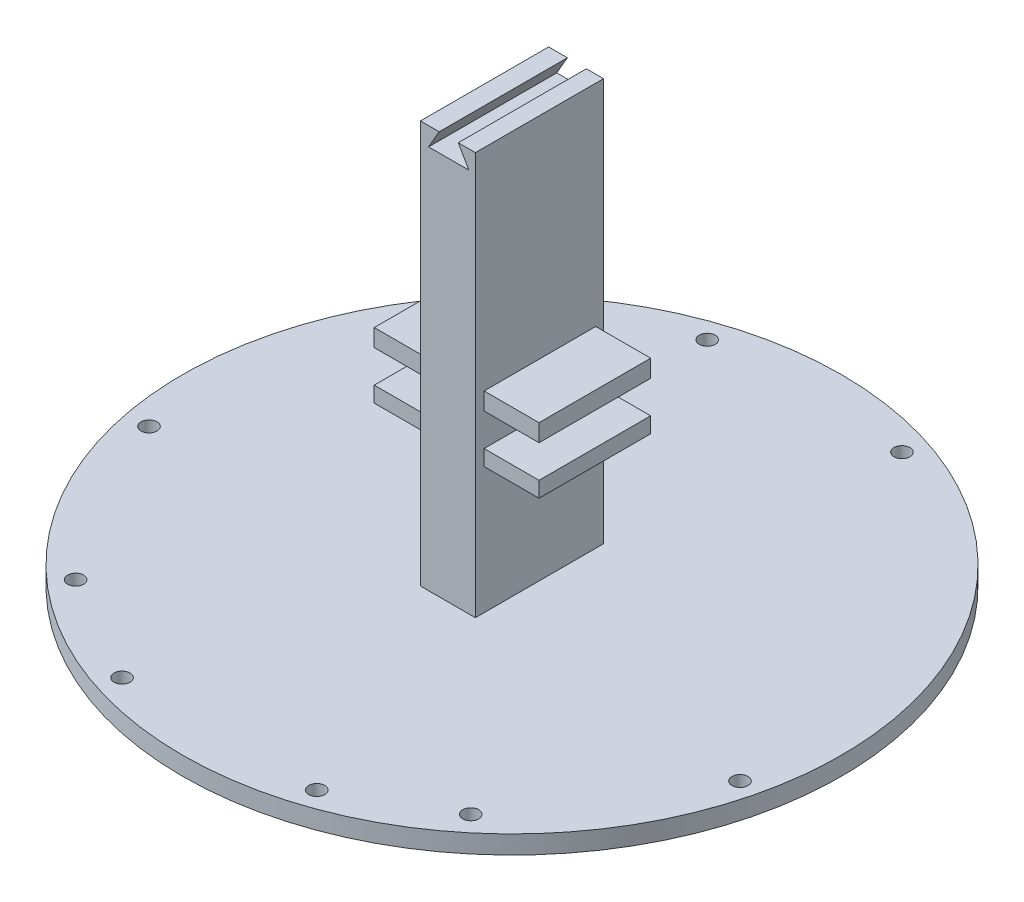
ISO-10303-21;
HEADER;
FILE_DESCRIPTION(('STEP AP214'),'2;1');
FILE_NAME('part.step','',(''),(''),'','','');
FILE_SCHEMA(('AUTOMOTIVE_DESIGN { 1 0 10303 214 1 1 1 1 }'));
ENDSEC;
DATA;
#1=APPLICATION_CONTEXT('core data for automotive mechanical design processes');
#2=APPLICATION_PROTOCOL_DEFINITION('international standard','automotive_design',2000,#1);
#3=PRODUCT_CONTEXT('',#1,'mechanical');
#4=PRODUCT('Part','Part','',(#3));
#5=PRODUCT_RELATED_PRODUCT_CATEGORY('part','',(#4));
#6=PRODUCT_DEFINITION_FORMATION('','',#4);
#7=PRODUCT_DEFINITION_CONTEXT('part definition',#1,'design');
#8=PRODUCT_DEFINITION('design','',#6,#7);
#9=PRODUCT_DEFINITION_SHAPE('','',#8);
#10=(LENGTH_UNIT() NAMED_UNIT(*) SI_UNIT(.MILLI.,.METRE.));
#11=(NAMED_UNIT(*) PLANE_ANGLE_UNIT() SI_UNIT($,.RADIAN.));
#12=(NAMED_UNIT(*) SI_UNIT($,.STERADIAN.) SOLID_ANGLE_UNIT());
#13=UNCERTAINTY_MEASURE_WITH_UNIT(LENGTH_MEASURE(1.E-05),#10,'distance_accuracy_value','');
#14=(GEOMETRIC_REPRESENTATION_CONTEXT(3) GLOBAL_UNCERTAINTY_ASSIGNED_CONTEXT((#13)) GLOBAL_UNIT_ASSIGNED_CONTEXT((#10,
#11,#12)) REPRESENTATION_CONTEXT('',''));
#15=CARTESIAN_POINT('',(0.,0.,0.));
#16=DIRECTION('',(0.,0.,1.));
#17=DIRECTION('',(1.,0.,0.));
#18=AXIS2_PLACEMENT_3D('',#15,#16,#17);
#19=CARTESIAN_POINT('',(-7.5,115.,17.5));
#20=DIRECTION('',(1.,0.,0.));
#21=DIRECTION('',(0.,0.,-1.));
#22=AXIS2_PLACEMENT_3D('',#19,#20,#21);
#23=PLANE('',#22);
#24=DIRECTION('',(0.,1.,0.));
#25=VECTOR('',#24,1.);
#26=CARTESIAN_POINT('',(-7.5,115.,-15.3709250448597));
#27=LINE('',#26,#25);
#28=CARTESIAN_POINT('',(-7.5,39.5746894468038,-15.3709250448597));
#29=VERTEX_POINT('',#28);
#30=CARTESIAN_POINT('',(-7.5,43.8235630364399,-15.3709250448597));
#31=VERTEX_POINT('',#30);
#32=EDGE_CURVE('E265',#29,#31,#27,.T.);
#33=ORIENTED_EDGE('',*,*,#32,.T.);
#34=DIRECTION('',(0.,0.,1.));
#35=VECTOR('',#34,1.);
#36=CARTESIAN_POINT('',(-7.5,43.8235630364399,17.5));
#37=LINE('',#36,#35);
#38=CARTESIAN_POINT('',(-7.5,43.8235630364399,15.1209913042929));
#39=VERTEX_POINT('',#38);
#40=EDGE_CURVE('E272',#31,#39,#37,.T.);
#41=ORIENTED_EDGE('',*,*,#40,.T.);
#42=DIRECTION('',(0.,-1.,0.));
#43=VECTOR('',#42,1.);
#44=CARTESIAN_POINT('',(-7.5,115.,15.1209913042929));
#45=LINE('',#44,#43);
#46=CARTESIAN_POINT('',(-7.5,39.5746894468038,15.1209913042929));
#47=VERTEX_POINT('',#46);
#48=EDGE_CURVE('E223',#39,#47,#45,.T.);
#49=ORIENTED_EDGE('',*,*,#48,.T.);
#50=DIRECTION('',(0.,0.,-1.));
#51=VECTOR('',#50,1.);
#52=CARTESIAN_POINT('',(-7.5,39.5746894468038,17.5));
#53=LINE('',#52,#51);
#54=EDGE_CURVE('E268',#47,#29,#53,.T.);
#55=ORIENTED_EDGE('',*,*,#54,.T.);
#56=EDGE_LOOP('',(#33,#41,#49,#55));
#57=FACE_BOUND('',#56,.T.);
#58=DIRECTION('',(0.,0.,1.));
#59=VECTOR('',#58,1.);
#60=CARTESIAN_POINT('',(-7.5,5.,17.5));
#61=LINE('',#60,#59);
#62=CARTESIAN_POINT('',(-7.5,5.,-17.5));
#63=VERTEX_POINT('',#62);
#64=CARTESIAN_POINT('',(-7.5,5.,17.5));
#65=VERTEX_POINT('',#64);
#66=EDGE_CURVE('E389',#63,#65,#61,.T.);
#67=ORIENTED_EDGE('',*,*,#66,.T.);
#68=DIRECTION('',(0.,-1.,0.));
#69=VECTOR('',#68,1.);
#70=CARTESIAN_POINT('',(-7.5,115.,17.5));
#71=LINE('',#70,#69);
#72=CARTESIAN_POINT('',(-7.5,115.,17.5));
#73=VERTEX_POINT('',#72);
#74=EDGE_CURVE('E423',#73,#65,#71,.T.);
#75=ORIENTED_EDGE('',*,*,#74,.F.);
#76=DIRECTION('',(0.,0.,1.));
#77=VECTOR('',#76,1.);
#78=CARTESIAN_POINT('',(-7.5,115.,17.5));
#79=LINE('',#78,#77);
#80=CARTESIAN_POINT('',(-7.5,115.,-17.5));
#81=VERTEX_POINT('',#80);
#82=EDGE_CURVE('E390',#81,#73,#79,.T.);
#83=ORIENTED_EDGE('',*,*,#82,.F.);
#84=DIRECTION('',(0.,-1.,0.));
#85=VECTOR('',#84,1.);
#86=CARTESIAN_POINT('',(-7.5,115.,-17.5));
#87=LINE('',#86,#85);
#88=EDGE_CURVE('E404',#81,#63,#87,.T.);
#89=ORIENTED_EDGE('',*,*,#88,.T.);
#90=EDGE_LOOP('',(#67,#75,#83,#89));
#91=FACE_BOUND('',#90,.T.);
#92=DIRECTION('',(0.,0.,1.));
#93=VECTOR('',#92,1.);
#94=CARTESIAN_POINT('',(-7.5,52.6962108265621,17.5));
#95=LINE('',#94,#93);
#96=CARTESIAN_POINT('',(-7.5,52.6962108265621,-15.3709250448597));
#97=VERTEX_POINT('',#96);
#98=CARTESIAN_POINT('',(-7.5,52.6962108265621,15.1209913042929));
#99=VERTEX_POINT('',#98);
#100=EDGE_CURVE('E320',#97,#99,#95,.T.);
#101=ORIENTED_EDGE('',*,*,#100,.F.);
#102=DIRECTION('',(0.,-1.,0.));
#103=VECTOR('',#102,1.);
#104=CARTESIAN_POINT('',(-7.5,115.,-15.3709250448597));
#105=LINE('',#104,#103);
#106=CARTESIAN_POINT('',(-7.5,57.4449518973318,-15.3709250448597));
#107=VERTEX_POINT('',#106);
#108=EDGE_CURVE('E299',#107,#97,#105,.T.);
#109=ORIENTED_EDGE('',*,*,#108,.F.);
#110=DIRECTION('',(0.,0.,-1.));
#111=VECTOR('',#110,1.);
#112=CARTESIAN_POINT('',(-7.5,57.4449518973318,17.5));
#113=LINE('',#112,#111);
#114=CARTESIAN_POINT('',(-7.5,57.4449518973318,15.1209913042929));
#115=VERTEX_POINT('',#114);
#116=EDGE_CURVE('E314',#115,#107,#113,.T.);
#117=ORIENTED_EDGE('',*,*,#116,.F.);
#118=DIRECTION('',(0.,1.,0.));
#119=VECTOR('',#118,1.);
#120=CARTESIAN_POINT('',(-7.5,115.,15.1209913042929));
#121=LINE('',#120,#119);
#122=EDGE_CURVE('E317',#99,#115,#121,.T.);
#123=ORIENTED_EDGE('',*,*,#122,.F.);
#124=EDGE_LOOP('',(#101,#109,#117,#123));
#125=FACE_BOUND('',#124,.T.);
#126=ADVANCED_FACE('F56',(#57,#91,#125),#23,.F.);
#127=CARTESIAN_POINT('',(7.5,115.,17.5));
#128=DIRECTION('',(-1.,0.,0.));
#129=DIRECTION('',(0.,0.,1.));
#130=AXIS2_PLACEMENT_3D('',#127,#128,#129);
#131=PLANE('',#130);
#132=DIRECTION('',(0.,1.,0.));
#133=VECTOR('',#132,1.);
#134=CARTESIAN_POINT('',(7.5,115.,15.1209913042929));
#135=LINE('',#134,#133);
#136=CARTESIAN_POINT('',(7.5,39.5746894468038,15.1209913042929));
#137=VERTEX_POINT('',#136);
#138=CARTESIAN_POINT('',(7.5,43.8235630364399,15.1209913042929));
#139=VERTEX_POINT('',#138);
#140=EDGE_CURVE('E64',#137,#139,#135,.T.);
#141=ORIENTED_EDGE('',*,*,#140,.T.);
#142=DIRECTION('',(0.,0.,-1.));
#143=VECTOR('',#142,1.);
#144=CARTESIAN_POINT('',(7.5,43.8235630364399,17.5));
#145=LINE('',#144,#143);
#146=CARTESIAN_POINT('',(7.5,43.8235630364399,-15.3709250448597));
#147=VERTEX_POINT('',#146);
#148=EDGE_CURVE('E14',#139,#147,#145,.T.);
#149=ORIENTED_EDGE('',*,*,#148,.T.);
#150=DIRECTION('',(0.,-1.,0.));
#151=VECTOR('',#150,1.);
#152=CARTESIAN_POINT('',(7.5,115.,-15.3709250448597));
#153=LINE('',#152,#151);
#154=CARTESIAN_POINT('',(7.5,39.5746894468038,-15.3709250448597));
#155=VERTEX_POINT('',#154);
#156=EDGE_CURVE('E451',#147,#155,#153,.T.);
#157=ORIENTED_EDGE('',*,*,#156,.T.);
#158=DIRECTION('',(0.,0.,1.));
#159=VECTOR('',#158,1.);
#160=CARTESIAN_POINT('',(7.5,39.5746894468038,17.5));
#161=LINE('',#160,#159);
#162=EDGE_CURVE('E454',#155,#137,#161,.T.);
#163=ORIENTED_EDGE('',*,*,#162,.T.);
#164=EDGE_LOOP('',(#141,#149,#157,#163));
#165=FACE_BOUND('',#164,.T.);
#166=DIRECTION('',(0.,0.,-1.));
#167=VECTOR('',#166,1.);
#168=CARTESIAN_POINT('',(7.5,5.,17.5));
#169=LINE('',#168,#167);
#170=CARTESIAN_POINT('',(7.5,5.,17.5));
#171=VERTEX_POINT('',#170);
#172=CARTESIAN_POINT('',(7.5,5.,-17.5));
#173=VERTEX_POINT('',#172);
#174=EDGE_CURVE('E410',#171,#173,#169,.T.);
#175=ORIENTED_EDGE('',*,*,#174,.T.);
#176=DIRECTION('',(0.,-1.,0.));
#177=VECTOR('',#176,1.);
#178=CARTESIAN_POINT('',(7.5,115.,-17.5));
#179=LINE('',#178,#177);
#180=CARTESIAN_POINT('',(7.5,115.,-17.5));
#181=VERTEX_POINT('',#180);
#182=EDGE_CURVE('E417',#181,#173,#179,.T.);
#183=ORIENTED_EDGE('',*,*,#182,.F.);
#184=DIRECTION('',(0.,0.,-1.));
#185=VECTOR('',#184,1.);
#186=CARTESIAN_POINT('',(7.5,115.,17.5));
#187=LINE('',#186,#185);
#188=CARTESIAN_POINT('',(7.5,115.,17.5));
#189=VERTEX_POINT('',#188);
#190=EDGE_CURVE('E398',#189,#181,#187,.T.);
#191=ORIENTED_EDGE('',*,*,#190,.F.);
#192=DIRECTION('',(0.,-1.,0.));
#193=VECTOR('',#192,1.);
#194=CARTESIAN_POINT('',(7.5,115.,17.5));
#195=LINE('',#194,#193);
#196=EDGE_CURVE('E420',#189,#171,#195,.T.);
#197=ORIENTED_EDGE('',*,*,#196,.T.);
#198=EDGE_LOOP('',(#175,#183,#191,#197));
#199=FACE_BOUND('',#198,.T.);
#200=DIRECTION('',(0.,0.,-1.));
#201=VECTOR('',#200,1.);
#202=CARTESIAN_POINT('',(7.5,52.6962108265621,17.5));
#203=LINE('',#202,#201);
#204=CARTESIAN_POINT('',(7.5,52.6962108265621,15.1209913042929));
#205=VERTEX_POINT('',#204);
#206=CARTESIAN_POINT('',(7.5,52.6962108265621,-15.3709250448597));
#207=VERTEX_POINT('',#206);
#208=EDGE_CURVE('E448',#205,#207,#203,.T.);
#209=ORIENTED_EDGE('',*,*,#208,.F.);
#210=DIRECTION('',(0.,-1.,0.));
#211=VECTOR('',#210,1.);
#212=CARTESIAN_POINT('',(7.5,115.,15.1209913042929));
#213=LINE('',#212,#211);
#214=CARTESIAN_POINT('',(7.5,57.4449518973318,15.1209913042929));
#215=VERTEX_POINT('',#214);
#216=EDGE_CURVE('E445',#215,#205,#213,.T.);
#217=ORIENTED_EDGE('',*,*,#216,.F.);
#218=DIRECTION('',(0.,0.,1.));
#219=VECTOR('',#218,1.);
#220=CARTESIAN_POINT('',(7.5,57.4449518973318,17.5));
#221=LINE('',#220,#219);
#222=CARTESIAN_POINT('',(7.5,57.4449518973318,-15.3709250448597));
#223=VERTEX_POINT('',#222);
#224=EDGE_CURVE('E442',#223,#215,#221,.T.);
#225=ORIENTED_EDGE('',*,*,#224,.F.);
#226=DIRECTION('',(0.,1.,0.));
#227=VECTOR('',#226,1.);
#228=CARTESIAN_POINT('',(7.5,115.,-15.3709250448597));
#229=LINE('',#228,#227);
#230=EDGE_CURVE('E439',#207,#223,#229,.T.);
#231=ORIENTED_EDGE('',*,*,#230,.F.);
#232=EDGE_LOOP('',(#209,#217,#225,#231));
#233=FACE_BOUND('',#232,.T.);
#234=ADVANCED_FACE('F458',(#165,#199,#233),#131,.F.);
#235=CARTESIAN_POINT('',(0.,115.,0.));
#236=DIRECTION('',(0.,1.,0.));
#237=DIRECTION('',(0.,0.,1.));
#238=AXIS2_PLACEMENT_3D('',#235,#236,#237);
#239=PLANE('',#238);
#240=DIRECTION('',(0.,0.,-1.));
#241=VECTOR('',#240,1.);
#242=CARTESIAN_POINT('',(2.82644831534013,115.,0.));
#243=LINE('',#242,#241);
#244=CARTESIAN_POINT('',(2.82644831534013,115.,17.5));
#245=VERTEX_POINT('',#244);
#246=CARTESIAN_POINT('',(2.82644831534013,115.,-17.5));
#247=VERTEX_POINT('',#246);
#248=EDGE_CURVE('E434',#245,#247,#243,.T.);
#249=ORIENTED_EDGE('',*,*,#248,.F.);
#250=DIRECTION('',(1.,0.,0.));
#251=VECTOR('',#250,1.);
#252=CARTESIAN_POINT('',(7.5,115.,17.5));
#253=LINE('',#252,#251);
#254=EDGE_CURVE('E393',#245,#189,#253,.T.);
#255=ORIENTED_EDGE('',*,*,#254,.T.);
#256=ORIENTED_EDGE('',*,*,#190,.T.);
#257=DIRECTION('',(-1.,0.,0.));
#258=VECTOR('',#257,1.);
#259=CARTESIAN_POINT('',(7.5,115.,-17.5));
#260=LINE('',#259,#258);
#261=EDGE_CURVE('E401',#181,#247,#260,.T.);
#262=ORIENTED_EDGE('',*,*,#261,.T.);
#263=EDGE_LOOP('',(#249,#255,#256,#262));
#264=FACE_BOUND('',#263,.T.);
#265=ADVANCED_FACE('F487',(#264),#239,.T.);
#266=CARTESIAN_POINT('',(0.,5.,0.));
#267=DIRECTION('',(0.,-1.,0.));
#268=DIRECTION('',(0.,0.,-1.));
#269=AXIS2_PLACEMENT_3D('',#266,#267,#268);
#270=CYLINDRICAL_SURFACE('',#269,90.);
#271=CARTESIAN_POINT('',(0.,5.,0.));
#272=DIRECTION('',(0.,1.,0.));
#273=DIRECTION('',(0.,0.,1.));
#274=AXIS2_PLACEMENT_3D('',#271,#272,#273);
#275=CIRCLE('',#274,90.);
#276=CARTESIAN_POINT('',(0.,5.,90.));
#277=VERTEX_POINT('',#276);
#278=EDGE_CURVE('E427',#277,#277,#275,.T.);
#279=ORIENTED_EDGE('',*,*,#278,.F.);
#280=EDGE_LOOP('',(#279));
#281=FACE_BOUND('',#280,.T.);
#282=CARTESIAN_POINT('',(0.,0.,0.));
#283=DIRECTION('',(0.,1.,0.));
#284=DIRECTION('',(0.,0.,1.));
#285=AXIS2_PLACEMENT_3D('',#282,#283,#284);
#286=CIRCLE('',#285,90.);
#287=CARTESIAN_POINT('',(0.,0.,90.));
#288=VERTEX_POINT('',#287);
#289=EDGE_CURVE('E426',#288,#288,#286,.T.);
#290=ORIENTED_EDGE('',*,*,#289,.T.);
#291=EDGE_LOOP('',(#290));
#292=FACE_BOUND('',#291,.T.);
#293=ADVANCED_FACE('F58',(#281,#292),#270,.T.);
#294=CARTESIAN_POINT('',(0.,5.,0.));
#295=DIRECTION('',(0.,1.,0.));
#296=DIRECTION('',(0.,0.,1.));
#297=AXIS2_PLACEMENT_3D('',#294,#295,#296);
#298=PLANE('',#297);
#299=CARTESIAN_POINT('',(-82.3103290653493,5.,16.825152102193));
#300=DIRECTION('',(0.,1.,0.));
#301=DIRECTION('',(0.,0.,1.));
#302=AXIS2_PLACEMENT_3D('',#299,#300,#301);
#303=CIRCLE('',#302,2.18255);
#304=CARTESIAN_POINT('',(-82.3103290653493,5.,19.007702102193));
#305=VERTEX_POINT('',#304);
#306=EDGE_CURVE('E368',#305,#305,#303,.T.);
#307=ORIENTED_EDGE('',*,*,#306,.F.);
#308=EDGE_LOOP('',(#307));
#309=FACE_BOUND('',#308,.T.);
#310=CARTESIAN_POINT('',(-56.093218167113,5.,63.0821731492684));
#311=DIRECTION('',(0.,1.,0.));
#312=DIRECTION('',(0.,0.,1.));
#313=AXIS2_PLACEMENT_3D('',#310,#311,#312);
#314=CIRCLE('',#313,2.18255);
#315=CARTESIAN_POINT('',(-56.093218167113,5.,65.2647231492684));
#316=VERTEX_POINT('',#315);
#317=EDGE_CURVE('E365',#316,#316,#314,.T.);
#318=ORIENTED_EDGE('',*,*,#317,.F.);
#319=EDGE_LOOP('',(#318));
#320=FACE_BOUND('',#319,.T.);
#321=CARTESIAN_POINT('',(-26.585,5.,79.9073252514612));
#322=DIRECTION('',(0.,1.,0.));
#323=DIRECTION('',(0.,0.,1.));
#324=AXIS2_PLACEMENT_3D('',#321,#322,#323);
#325=CIRCLE('',#324,2.18255);
#326=CARTESIAN_POINT('',(-26.585,5.,82.0898752514612));
#327=VERTEX_POINT('',#326);
#328=EDGE_CURVE('E362',#327,#327,#325,.T.);
#329=ORIENTED_EDGE('',*,*,#328,.F.);
#330=EDGE_LOOP('',(#329));
#331=FACE_BOUND('',#330,.T.);
#332=CARTESIAN_POINT('',(26.585,5.,79.9073252514612));
#333=DIRECTION('',(0.,1.,0.));
#334=DIRECTION('',(0.,0.,1.));
#335=AXIS2_PLACEMENT_3D('',#332,#333,#334);
#336=CIRCLE('',#335,2.18255);
#337=CARTESIAN_POINT('',(26.585,5.,82.0898752514612));
#338=VERTEX_POINT('',#337);
#339=EDGE_CURVE('E359',#338,#338,#336,.T.);
#340=ORIENTED_EDGE('',*,*,#339,.F.);
#341=EDGE_LOOP('',(#340));
#342=FACE_BOUND('',#341,.T.);
#343=CARTESIAN_POINT('',(82.2453022818043,5.,19.9780897386926));
#344=DIRECTION('',(0.,1.,0.));
#345=DIRECTION('',(0.,0.,1.));
#346=AXIS2_PLACEMENT_3D('',#343,#344,#345);
#347=CIRCLE('',#346,2.18255);
#348=CARTESIAN_POINT('',(82.2453022818043,5.,22.1606397386926));
#349=VERTEX_POINT('',#348);
#350=EDGE_CURVE('E356',#349,#349,#347,.T.);
#351=ORIENTED_EDGE('',*,*,#350,.F.);
#352=EDGE_LOOP('',(#351));
#353=FACE_BOUND('',#352,.T.);
#354=CARTESIAN_POINT('',(53.3465637883439,5.,64.6125029474108));
#355=DIRECTION('',(0.,1.,0.));
#356=DIRECTION('',(0.,0.,1.));
#357=AXIS2_PLACEMENT_3D('',#354,#355,#356);
#358=CIRCLE('',#357,2.18255);
#359=CARTESIAN_POINT('',(53.3465637883439,5.,66.7950529474108));
#360=VERTEX_POINT('',#359);
#361=EDGE_CURVE('E353',#360,#360,#358,.T.);
#362=ORIENTED_EDGE('',*,*,#361,.F.);
#363=EDGE_LOOP('',(#362));
#364=FACE_BOUND('',#363,.T.);
#365=CARTESIAN_POINT('',(26.5850000000001,5.,-79.9073252514612));
#366=DIRECTION('',(0.,1.,0.));
#367=DIRECTION('',(0.,0.,1.));
#368=AXIS2_PLACEMENT_3D('',#365,#366,#367);
#369=CIRCLE('',#368,2.18255);
#370=CARTESIAN_POINT('',(26.5850000000001,5.,-77.7247752514612));
#371=VERTEX_POINT('',#370);
#372=EDGE_CURVE('E350',#371,#371,#369,.T.);
#373=ORIENTED_EDGE('',*,*,#372,.F.);
#374=EDGE_LOOP('',(#373));
#375=FACE_BOUND('',#374,.T.);
#376=CARTESIAN_POINT('',(-26.585,5.,-79.9073252514612));
#377=DIRECTION('',(0.,1.,0.));
#378=DIRECTION('',(0.,0.,1.));
#379=AXIS2_PLACEMENT_3D('',#376,#377,#378);
#380=CIRCLE('',#379,2.18255);
#381=CARTESIAN_POINT('',(-26.585,5.,-77.7247752514612));
#382=VERTEX_POINT('',#381);
#383=EDGE_CURVE('E327',#382,#382,#380,.T.);
#384=ORIENTED_EDGE('',*,*,#383,.F.);
#385=EDGE_LOOP('',(#384));
#386=FACE_BOUND('',#385,.T.);
#387=ORIENTED_EDGE('',*,*,#66,.F.);
#388=DIRECTION('',(-1.,0.,0.));
#389=VECTOR('',#388,1.);
#390=CARTESIAN_POINT('',(7.5,5.,-17.5));
#391=LINE('',#390,#389);
#392=EDGE_CURVE('E394',#173,#63,#391,.T.);
#393=ORIENTED_EDGE('',*,*,#392,.F.);
#394=ORIENTED_EDGE('',*,*,#174,.F.);
#395=DIRECTION('',(1.,0.,0.));
#396=VECTOR('',#395,1.);
#397=CARTESIAN_POINT('',(7.5,5.,17.5));
#398=LINE('',#397,#396);
#399=EDGE_CURVE('E407',#65,#171,#398,.T.);
#400=ORIENTED_EDGE('',*,*,#399,.F.);
#401=EDGE_LOOP('',(#387,#393,#394,#400));
#402=FACE_BOUND('',#401,.T.);
#403=ORIENTED_EDGE('',*,*,#278,.T.);
#404=EDGE_LOOP('',(#403));
#405=FACE_BOUND('',#404,.T.);
#406=ADVANCED_FACE('F493',(#309,#320,#331,#342,#353,#364,#375,#386,#402,#405),#298,.T.);
#407=CARTESIAN_POINT('',(0.,0.,0.));
#408=DIRECTION('',(0.,1.,0.));
#409=DIRECTION('',(0.,0.,1.));
#410=AXIS2_PLACEMENT_3D('',#407,#408,#409);
#411=PLANE('',#410);
#412=CARTESIAN_POINT('',(-82.3103290653493,0.,16.825152102193));
#413=DIRECTION('',(0.,-1.,0.));
#414=DIRECTION('',(0.,0.,-1.));
#415=AXIS2_PLACEMENT_3D('',#412,#413,#414);
#416=CIRCLE('',#415,2.18255);
#417=CARTESIAN_POINT('',(-82.3103290653493,0.,14.642602102193));
#418=VERTEX_POINT('',#417);
#419=EDGE_CURVE('E324',#418,#418,#416,.T.);
#420=ORIENTED_EDGE('',*,*,#419,.F.);
#421=EDGE_LOOP('',(#420));
#422=FACE_BOUND('',#421,.T.);
#423=CARTESIAN_POINT('',(-56.093218167113,0.,63.0821731492684));
#424=DIRECTION('',(0.,-1.,0.));
#425=DIRECTION('',(0.,0.,-1.));
#426=AXIS2_PLACEMENT_3D('',#423,#424,#425);
#427=CIRCLE('',#426,2.18255);
#428=CARTESIAN_POINT('',(-56.093218167113,0.,60.8996231492684));
#429=VERTEX_POINT('',#428);
#430=EDGE_CURVE('E323',#429,#429,#427,.T.);
#431=ORIENTED_EDGE('',*,*,#430,.F.);
#432=EDGE_LOOP('',(#431));
#433=FACE_BOUND('',#432,.T.);
#434=CARTESIAN_POINT('',(-26.585,0.,79.9073252514612));
#435=DIRECTION('',(0.,-1.,0.));
#436=DIRECTION('',(0.,0.,-1.));
#437=AXIS2_PLACEMENT_3D('',#434,#435,#436);
#438=CIRCLE('',#437,2.18255);
#439=CARTESIAN_POINT('',(-26.585,0.,77.7247752514612));
#440=VERTEX_POINT('',#439);
#441=EDGE_CURVE('E333',#440,#440,#438,.T.);
#442=ORIENTED_EDGE('',*,*,#441,.F.);
#443=EDGE_LOOP('',(#442));
#444=FACE_BOUND('',#443,.T.);
#445=CARTESIAN_POINT('',(26.585,0.,79.9073252514612));
#446=DIRECTION('',(0.,-1.,0.));
#447=DIRECTION('',(0.,0.,-1.));
#448=AXIS2_PLACEMENT_3D('',#445,#446,#447);
#449=CIRCLE('',#448,2.18255);
#450=CARTESIAN_POINT('',(26.585,0.,77.7247752514612));
#451=VERTEX_POINT('',#450);
#452=EDGE_CURVE('E329',#451,#451,#449,.T.);
#453=ORIENTED_EDGE('',*,*,#452,.F.);
#454=EDGE_LOOP('',(#453));
#455=FACE_BOUND('',#454,.T.);
#456=CARTESIAN_POINT('',(82.2453022818043,0.,19.9780897386926));
#457=DIRECTION('',(0.,-1.,0.));
#458=DIRECTION('',(0.,0.,-1.));
#459=AXIS2_PLACEMENT_3D('',#456,#457,#458);
#460=CIRCLE('',#459,2.18255);
#461=CARTESIAN_POINT('',(82.2453022818043,0.,17.7955397386926));
#462=VERTEX_POINT('',#461);
#463=EDGE_CURVE('E332',#462,#462,#460,.T.);
#464=ORIENTED_EDGE('',*,*,#463,.F.);
#465=EDGE_LOOP('',(#464));
#466=FACE_BOUND('',#465,.T.);
#467=CARTESIAN_POINT('',(53.3465637883439,0.,64.6125029474108));
#468=DIRECTION('',(0.,-1.,0.));
#469=DIRECTION('',(0.,0.,-1.));
#470=AXIS2_PLACEMENT_3D('',#467,#468,#469);
#471=CIRCLE('',#470,2.18255);
#472=CARTESIAN_POINT('',(53.3465637883439,0.,62.4299529474108));
#473=VERTEX_POINT('',#472);
#474=EDGE_CURVE('E343',#473,#473,#471,.T.);
#475=ORIENTED_EDGE('',*,*,#474,.F.);
#476=EDGE_LOOP('',(#475));
#477=FACE_BOUND('',#476,.T.);
#478=CARTESIAN_POINT('',(26.5850000000001,0.,-79.9073252514612));
#479=DIRECTION('',(0.,-1.,0.));
#480=DIRECTION('',(0.,0.,-1.));
#481=AXIS2_PLACEMENT_3D('',#478,#479,#480);
#482=CIRCLE('',#481,2.18255);
#483=CARTESIAN_POINT('',(26.5850000000001,0.,-82.0898752514612));
#484=VERTEX_POINT('',#483);
#485=EDGE_CURVE('E340',#484,#484,#482,.T.);
#486=ORIENTED_EDGE('',*,*,#485,.F.);
#487=EDGE_LOOP('',(#486));
#488=FACE_BOUND('',#487,.T.);
#489=CARTESIAN_POINT('',(-26.585,0.,-79.9073252514612));
#490=DIRECTION('',(0.,-1.,0.));
#491=DIRECTION('',(0.,0.,-1.));
#492=AXIS2_PLACEMENT_3D('',#489,#490,#491);
#493=CIRCLE('',#492,2.18255);
#494=CARTESIAN_POINT('',(-26.585,0.,-82.0898752514612));
#495=VERTEX_POINT('',#494);
#496=EDGE_CURVE('E328',#495,#495,#493,.T.);
#497=ORIENTED_EDGE('',*,*,#496,.F.);
#498=EDGE_LOOP('',(#497));
#499=FACE_BOUND('',#498,.T.);
#500=ORIENTED_EDGE('',*,*,#289,.F.);
#501=EDGE_LOOP('',(#500));
#502=FACE_BOUND('',#501,.T.);
#503=ADVANCED_FACE('F495',(#422,#433,#444,#455,#466,#477,#488,#499,#502),#411,.F.);
#504=CARTESIAN_POINT('',(7.5,115.,17.5));
#505=DIRECTION('',(0.,0.,-1.));
#506=DIRECTION('',(-1.,0.,0.));
#507=AXIS2_PLACEMENT_3D('',#504,#505,#506);
#508=PLANE('',#507);
#509=ORIENTED_EDGE('',*,*,#254,.F.);
#510=DIRECTION('',(-0.499999999999996,0.866025403784441,0.));
#511=VECTOR('',#510,1.);
#512=CARTESIAN_POINT('',(2.82644831534013,115.,17.5));
#513=LINE('',#512,#511);
#514=CARTESIAN_POINT('',(5.7264483153401,109.97705265805,17.5));
#515=VERTEX_POINT('',#514);
#516=EDGE_CURVE('E371',#515,#245,#513,.T.);
#517=ORIENTED_EDGE('',*,*,#516,.F.);
#518=DIRECTION('',(1.,0.,0.));
#519=VECTOR('',#518,1.);
#520=CARTESIAN_POINT('',(5.7264483153401,109.97705265805,17.5));
#521=LINE('',#520,#519);
#522=CARTESIAN_POINT('',(-5.2735516846599,109.97705265805,17.5));
#523=VERTEX_POINT('',#522);
#524=EDGE_CURVE('E376',#523,#515,#521,.T.);
#525=ORIENTED_EDGE('',*,*,#524,.F.);
#526=DIRECTION('',(-0.500000000000006,-0.866025403784435,0.));
#527=VECTOR('',#526,1.);
#528=CARTESIAN_POINT('',(-5.2735516846599,109.97705265805,17.5));
#529=LINE('',#528,#527);
#530=CARTESIAN_POINT('',(-2.37355168465986,115.,17.5));
#531=VERTEX_POINT('',#530);
#532=EDGE_CURVE('E373',#531,#523,#529,.T.);
#533=ORIENTED_EDGE('',*,*,#532,.F.);
#534=EDGE_CURVE('E395',#73,#531,#253,.T.);
#535=ORIENTED_EDGE('',*,*,#534,.F.);
#536=ORIENTED_EDGE('',*,*,#74,.T.);
#537=ORIENTED_EDGE('',*,*,#399,.T.);
#538=ORIENTED_EDGE('',*,*,#196,.F.);
#539=EDGE_LOOP('',(#509,#517,#525,#533,#535,#536,#537,#538));
#540=FACE_BOUND('',#539,.T.);
#541=ADVANCED_FACE('F492',(#540),#508,.F.);
#542=CARTESIAN_POINT('',(7.5,115.,-17.5));
#543=DIRECTION('',(0.,0.,1.));
#544=DIRECTION('',(1.,0.,0.));
#545=AXIS2_PLACEMENT_3D('',#542,#543,#544);
#546=PLANE('',#545);
#547=DIRECTION('',(1.,0.,0.));
#548=VECTOR('',#547,1.);
#549=CARTESIAN_POINT('',(7.5,109.97705265805,-17.5));
#550=LINE('',#549,#548);
#551=CARTESIAN_POINT('',(-5.2735516846599,109.97705265805,-17.5));
#552=VERTEX_POINT('',#551);
#553=CARTESIAN_POINT('',(5.7264483153401,109.97705265805,-17.5));
#554=VERTEX_POINT('',#553);
#555=EDGE_CURVE('E436',#552,#554,#550,.T.);
#556=ORIENTED_EDGE('',*,*,#555,.T.);
#557=DIRECTION('',(-0.499999999999996,0.866025403784441,0.));
#558=VECTOR('',#557,1.);
#559=CARTESIAN_POINT('',(3.99483623650507,112.976292757593,-17.5));
#560=LINE('',#559,#558);
#561=EDGE_CURVE('E386',#554,#247,#560,.T.);
#562=ORIENTED_EDGE('',*,*,#561,.T.);
#563=ORIENTED_EDGE('',*,*,#261,.F.);
#564=ORIENTED_EDGE('',*,*,#182,.T.);
#565=ORIENTED_EDGE('',*,*,#392,.T.);
#566=ORIENTED_EDGE('',*,*,#88,.F.);
#567=CARTESIAN_POINT('',(-2.37355168465984,115.,-17.5));
#568=VERTEX_POINT('',#567);
#569=EDGE_CURVE('E400',#568,#81,#260,.T.);
#570=ORIENTED_EDGE('',*,*,#569,.F.);
#571=DIRECTION('',(-0.500000000000006,-0.866025403784435,0.));
#572=VECTOR('',#571,1.);
#573=CARTESIAN_POINT('',(0.0948362365051714,119.275373292247,-17.5));
#574=LINE('',#573,#572);
#575=EDGE_CURVE('E382',#568,#552,#574,.T.);
#576=ORIENTED_EDGE('',*,*,#575,.T.);
#577=EDGE_LOOP('',(#556,#562,#563,#564,#565,#566,#570,#576));
#578=FACE_BOUND('',#577,.T.);
#579=ADVANCED_FACE('F502',(#578),#546,.F.);
#580=DIRECTION('',(0.,0.,1.));
#581=VECTOR('',#580,1.);
#582=CARTESIAN_POINT('',(-2.37355168465984,115.,0.));
#583=LINE('',#582,#581);
#584=EDGE_CURVE('E430',#568,#531,#583,.T.);
#585=ORIENTED_EDGE('',*,*,#584,.F.);
#586=ORIENTED_EDGE('',*,*,#569,.T.);
#587=ORIENTED_EDGE('',*,*,#82,.T.);
#588=ORIENTED_EDGE('',*,*,#534,.T.);
#589=EDGE_LOOP('',(#585,#586,#587,#588));
#590=FACE_BOUND('',#589,.T.);
#591=ADVANCED_FACE('F529',(#590),#239,.T.);
#592=CARTESIAN_POINT('',(5.7264483153401,109.97705265805,-18.5));
#593=DIRECTION('',(0.,-1.,0.));
#594=DIRECTION('',(0.,0.,-1.));
#595=AXIS2_PLACEMENT_3D('',#592,#593,#594);
#596=PLANE('',#595);
#597=DIRECTION('',(0.,0.,1.));
#598=VECTOR('',#597,1.);
#599=CARTESIAN_POINT('',(-5.2735516846599,109.97705265805,-18.5));
#600=LINE('',#599,#598);
#601=EDGE_CURVE('E379',#552,#523,#600,.T.);
#602=ORIENTED_EDGE('',*,*,#601,.T.);
#603=ORIENTED_EDGE('',*,*,#524,.T.);
#604=DIRECTION('',(0.,0.,1.));
#605=VECTOR('',#604,1.);
#606=CARTESIAN_POINT('',(5.7264483153401,109.97705265805,-18.5));
#607=LINE('',#606,#605);
#608=EDGE_CURVE('E380',#554,#515,#607,.T.);
#609=ORIENTED_EDGE('',*,*,#608,.F.);
#610=ORIENTED_EDGE('',*,*,#555,.F.);
#611=EDGE_LOOP('',(#602,#603,#609,#610));
#612=FACE_BOUND('',#611,.T.);
#613=ADVANCED_FACE('F538',(#612),#596,.F.);
#614=CARTESIAN_POINT('',(2.82644831534013,115.,-18.5));
#615=DIRECTION('',(0.866025403784441,0.499999999999996,0.));
#616=DIRECTION('',(-0.499999999999996,0.866025403784441,0.));
#617=AXIS2_PLACEMENT_3D('',#614,#615,#616);
#618=PLANE('',#617);
#619=ORIENTED_EDGE('',*,*,#608,.T.);
#620=ORIENTED_EDGE('',*,*,#516,.T.);
#621=ORIENTED_EDGE('',*,*,#248,.T.);
#622=ORIENTED_EDGE('',*,*,#561,.F.);
#623=EDGE_LOOP('',(#619,#620,#621,#622));
#624=FACE_BOUND('',#623,.T.);
#625=ADVANCED_FACE('F544',(#624),#618,.F.);
#626=CARTESIAN_POINT('',(-5.2735516846599,109.97705265805,-18.5));
#627=DIRECTION('',(-0.866025403784435,0.500000000000006,0.));
#628=DIRECTION('',(-0.500000000000006,-0.866025403784435,0.));
#629=AXIS2_PLACEMENT_3D('',#626,#627,#628);
#630=PLANE('',#629);
#631=ORIENTED_EDGE('',*,*,#584,.T.);
#632=ORIENTED_EDGE('',*,*,#532,.T.);
#633=ORIENTED_EDGE('',*,*,#601,.F.);
#634=ORIENTED_EDGE('',*,*,#575,.F.);
#635=EDGE_LOOP('',(#631,#632,#633,#634));
#636=FACE_BOUND('',#635,.T.);
#637=ADVANCED_FACE('F561',(#636),#630,.F.);
#638=CARTESIAN_POINT('',(-26.585,62.,-79.9073252514612));
#639=DIRECTION('',(0.,-1.,0.));
#640=DIRECTION('',(0.,0.,-1.));
#641=AXIS2_PLACEMENT_3D('',#638,#639,#640);
#642=CYLINDRICAL_SURFACE('',#641,2.18255);
#643=ORIENTED_EDGE('',*,*,#383,.T.);
#644=EDGE_LOOP('',(#643));
#645=FACE_BOUND('',#644,.T.);
#646=ORIENTED_EDGE('',*,*,#496,.T.);
#647=EDGE_LOOP('',(#646));
#648=FACE_BOUND('',#647,.T.);
#649=ADVANCED_FACE('F573',(#645,#648),#642,.F.);
#650=CARTESIAN_POINT('',(26.5850000000001,62.,-79.9073252514612));
#651=DIRECTION('',(0.,-1.,0.));
#652=DIRECTION('',(0.,0.,-1.));
#653=AXIS2_PLACEMENT_3D('',#650,#651,#652);
#654=CYLINDRICAL_SURFACE('',#653,2.18255);
#655=ORIENTED_EDGE('',*,*,#372,.T.);
#656=EDGE_LOOP('',(#655));
#657=FACE_BOUND('',#656,.T.);
#658=ORIENTED_EDGE('',*,*,#485,.T.);
#659=EDGE_LOOP('',(#658));
#660=FACE_BOUND('',#659,.T.);
#661=ADVANCED_FACE('F584',(#657,#660),#654,.F.);
#662=CARTESIAN_POINT('',(53.3465637883439,62.,64.6125029474108));
#663=DIRECTION('',(0.,-1.,0.));
#664=DIRECTION('',(0.,0.,-1.));
#665=AXIS2_PLACEMENT_3D('',#662,#663,#664);
#666=CYLINDRICAL_SURFACE('',#665,2.18255);
#667=ORIENTED_EDGE('',*,*,#361,.T.);
#668=EDGE_LOOP('',(#667));
#669=FACE_BOUND('',#668,.T.);
#670=ORIENTED_EDGE('',*,*,#474,.T.);
#671=EDGE_LOOP('',(#670));
#672=FACE_BOUND('',#671,.T.);
#673=ADVANCED_FACE('F580',(#669,#672),#666,.F.);
#674=CARTESIAN_POINT('',(82.2453022818043,62.,19.9780897386926));
#675=DIRECTION('',(0.,-1.,0.));
#676=DIRECTION('',(0.,0.,-1.));
#677=AXIS2_PLACEMENT_3D('',#674,#675,#676);
#678=CYLINDRICAL_SURFACE('',#677,2.18255);
#679=ORIENTED_EDGE('',*,*,#350,.T.);
#680=EDGE_LOOP('',(#679));
#681=FACE_BOUND('',#680,.T.);
#682=ORIENTED_EDGE('',*,*,#463,.T.);
#683=EDGE_LOOP('',(#682));
#684=FACE_BOUND('',#683,.T.);
#685=ADVANCED_FACE('F576',(#681,#684),#678,.F.);
#686=CARTESIAN_POINT('',(26.585,62.,79.9073252514612));
#687=DIRECTION('',(0.,-1.,0.));
#688=DIRECTION('',(0.,0.,-1.));
#689=AXIS2_PLACEMENT_3D('',#686,#687,#688);
#690=CYLINDRICAL_SURFACE('',#689,2.18255);
#691=ORIENTED_EDGE('',*,*,#339,.T.);
#692=EDGE_LOOP('',(#691));
#693=FACE_BOUND('',#692,.T.);
#694=ORIENTED_EDGE('',*,*,#452,.T.);
#695=EDGE_LOOP('',(#694));
#696=FACE_BOUND('',#695,.T.);
#697=ADVANCED_FACE('F579',(#693,#696),#690,.F.);
#698=CARTESIAN_POINT('',(-26.585,62.,79.9073252514612));
#699=DIRECTION('',(0.,-1.,0.));
#700=DIRECTION('',(0.,0.,-1.));
#701=AXIS2_PLACEMENT_3D('',#698,#699,#700);
#702=CYLINDRICAL_SURFACE('',#701,2.18255);
#703=ORIENTED_EDGE('',*,*,#328,.T.);
#704=EDGE_LOOP('',(#703));
#705=FACE_BOUND('',#704,.T.);
#706=ORIENTED_EDGE('',*,*,#441,.T.);
#707=EDGE_LOOP('',(#706));
#708=FACE_BOUND('',#707,.T.);
#709=ADVANCED_FACE('F596',(#705,#708),#702,.F.);
#710=CARTESIAN_POINT('',(-56.093218167113,62.,63.0821731492684));
#711=DIRECTION('',(0.,-1.,0.));
#712=DIRECTION('',(0.,0.,-1.));
#713=AXIS2_PLACEMENT_3D('',#710,#711,#712);
#714=CYLINDRICAL_SURFACE('',#713,2.18255);
#715=ORIENTED_EDGE('',*,*,#317,.T.);
#716=EDGE_LOOP('',(#715));
#717=FACE_BOUND('',#716,.T.);
#718=ORIENTED_EDGE('',*,*,#430,.T.);
#719=EDGE_LOOP('',(#718));
#720=FACE_BOUND('',#719,.T.);
#721=ADVANCED_FACE('F592',(#717,#720),#714,.F.);
#722=CARTESIAN_POINT('',(-82.3103290653493,62.,16.825152102193));
#723=DIRECTION('',(0.,-1.,0.));
#724=DIRECTION('',(0.,0.,-1.));
#725=AXIS2_PLACEMENT_3D('',#722,#723,#724);
#726=CYLINDRICAL_SURFACE('',#725,2.18255);
#727=ORIENTED_EDGE('',*,*,#306,.T.);
#728=EDGE_LOOP('',(#727));
#729=FACE_BOUND('',#728,.T.);
#730=ORIENTED_EDGE('',*,*,#419,.T.);
#731=EDGE_LOOP('',(#730));
#732=FACE_BOUND('',#731,.T.);
#733=ADVANCED_FACE('F595',(#729,#732),#726,.F.);
#734=CARTESIAN_POINT('',(22.5,0.,0.));
#735=DIRECTION('',(1.,0.,0.));
#736=DIRECTION('',(0.,0.,-1.));
#737=AXIS2_PLACEMENT_3D('',#734,#735,#736);
#738=PLANE('',#737);
#739=DIRECTION('',(0.,0.,1.));
#740=VECTOR('',#739,1.);
#741=CARTESIAN_POINT('',(22.5,52.6962108265621,0.));
#742=LINE('',#741,#740);
#743=CARTESIAN_POINT('',(22.5,52.6962108265621,-15.3709250448597));
#744=VERTEX_POINT('',#743);
#745=CARTESIAN_POINT('',(22.5,52.6962108265621,15.1209913042929));
#746=VERTEX_POINT('',#745);
#747=EDGE_CURVE('E274',#744,#746,#742,.T.);
#748=ORIENTED_EDGE('',*,*,#747,.F.);
#749=DIRECTION('',(0.,-1.,0.));
#750=VECTOR('',#749,1.);
#751=CARTESIAN_POINT('',(22.5,0.,-15.3709250448597));
#752=LINE('',#751,#750);
#753=CARTESIAN_POINT('',(22.5,57.4449518973318,-15.3709250448597));
#754=VERTEX_POINT('',#753);
#755=EDGE_CURVE('E277',#754,#744,#752,.T.);
#756=ORIENTED_EDGE('',*,*,#755,.F.);
#757=DIRECTION('',(0.,0.,-1.));
#758=VECTOR('',#757,1.);
#759=CARTESIAN_POINT('',(22.5,57.4449518973318,0.));
#760=LINE('',#759,#758);
#761=CARTESIAN_POINT('',(22.5,57.4449518973318,15.1209913042929));
#762=VERTEX_POINT('',#761);
#763=EDGE_CURVE('E280',#762,#754,#760,.T.);
#764=ORIENTED_EDGE('',*,*,#763,.F.);
#765=DIRECTION('',(0.,1.,0.));
#766=VECTOR('',#765,1.);
#767=CARTESIAN_POINT('',(22.5,0.,15.1209913042929));
#768=LINE('',#767,#766);
#769=EDGE_CURVE('E283',#746,#762,#768,.T.);
#770=ORIENTED_EDGE('',*,*,#769,.F.);
#771=EDGE_LOOP('',(#748,#756,#764,#770));
#772=FACE_BOUND('',#771,.T.);
#773=ADVANCED_FACE('F606',(#772),#738,.T.);
#774=CARTESIAN_POINT('',(-22.5,0.,-15.3709250448597));
#775=DIRECTION('',(0.,0.,1.));
#776=DIRECTION('',(1.,0.,0.));
#777=AXIS2_PLACEMENT_3D('',#774,#775,#776);
#778=PLANE('',#777);
#779=DIRECTION('',(1.,0.,0.));
#780=VECTOR('',#779,1.);
#781=CARTESIAN_POINT('',(-22.5,52.6962108265621,-15.3709250448597));
#782=LINE('',#781,#780);
#783=EDGE_CURVE('E295',#207,#744,#782,.T.);
#784=ORIENTED_EDGE('',*,*,#783,.F.);
#785=ORIENTED_EDGE('',*,*,#230,.T.);
#786=DIRECTION('',(1.,0.,0.));
#787=VECTOR('',#786,1.);
#788=CARTESIAN_POINT('',(-22.5,57.4449518973318,-15.3709250448597));
#789=LINE('',#788,#787);
#790=EDGE_CURVE('E308',#223,#754,#789,.T.);
#791=ORIENTED_EDGE('',*,*,#790,.T.);
#792=ORIENTED_EDGE('',*,*,#755,.T.);
#793=EDGE_LOOP('',(#784,#785,#791,#792));
#794=FACE_BOUND('',#793,.T.);
#795=ADVANCED_FACE('F620',(#794),#778,.F.);
#796=CARTESIAN_POINT('',(-22.5,57.4449518973318,0.));
#797=DIRECTION('',(0.,-1.,0.));
#798=DIRECTION('',(0.,0.,-1.));
#799=AXIS2_PLACEMENT_3D('',#796,#797,#798);
#800=PLANE('',#799);
#801=ORIENTED_EDGE('',*,*,#790,.F.);
#802=ORIENTED_EDGE('',*,*,#224,.T.);
#803=DIRECTION('',(1.,0.,0.));
#804=VECTOR('',#803,1.);
#805=CARTESIAN_POINT('',(-22.5,57.4449518973318,15.1209913042929));
#806=LINE('',#805,#804);
#807=EDGE_CURVE('E304',#215,#762,#806,.T.);
#808=ORIENTED_EDGE('',*,*,#807,.T.);
#809=ORIENTED_EDGE('',*,*,#763,.T.);
#810=EDGE_LOOP('',(#801,#802,#808,#809));
#811=FACE_BOUND('',#810,.T.);
#812=ADVANCED_FACE('F624',(#811),#800,.F.);
#813=CARTESIAN_POINT('',(-22.5,0.,15.1209913042929));
#814=DIRECTION('',(0.,0.,-1.));
#815=DIRECTION('',(-1.,0.,0.));
#816=AXIS2_PLACEMENT_3D('',#813,#814,#815);
#817=PLANE('',#816);
#818=ORIENTED_EDGE('',*,*,#807,.F.);
#819=ORIENTED_EDGE('',*,*,#216,.T.);
#820=DIRECTION('',(1.,0.,0.));
#821=VECTOR('',#820,1.);
#822=CARTESIAN_POINT('',(-22.5,52.6962108265621,15.1209913042929));
#823=LINE('',#822,#821);
#824=EDGE_CURVE('E300',#205,#746,#823,.T.);
#825=ORIENTED_EDGE('',*,*,#824,.T.);
#826=ORIENTED_EDGE('',*,*,#769,.T.);
#827=EDGE_LOOP('',(#818,#819,#825,#826));
#828=FACE_BOUND('',#827,.T.);
#829=ADVANCED_FACE('F628',(#828),#817,.F.);
#830=CARTESIAN_POINT('',(-22.5,52.6962108265621,0.));
#831=DIRECTION('',(0.,1.,0.));
#832=DIRECTION('',(0.,0.,1.));
#833=AXIS2_PLACEMENT_3D('',#830,#831,#832);
#834=PLANE('',#833);
#835=ORIENTED_EDGE('',*,*,#824,.F.);
#836=ORIENTED_EDGE('',*,*,#208,.T.);
#837=ORIENTED_EDGE('',*,*,#783,.T.);
#838=ORIENTED_EDGE('',*,*,#747,.T.);
#839=EDGE_LOOP('',(#835,#836,#837,#838));
#840=FACE_BOUND('',#839,.T.);
#841=ADVANCED_FACE('F612',(#840),#834,.F.);
#842=CARTESIAN_POINT('',(-22.5,52.6962108265621,-15.3709250448597));
#843=VERTEX_POINT('',#842);
#844=EDGE_CURVE('E309',#843,#97,#782,.T.);
#845=ORIENTED_EDGE('',*,*,#844,.T.);
#846=ORIENTED_EDGE('',*,*,#100,.T.);
#847=CARTESIAN_POINT('',(-22.5,52.6962108265621,15.1209913042929));
#848=VERTEX_POINT('',#847);
#849=EDGE_CURVE('E296',#848,#99,#823,.T.);
#850=ORIENTED_EDGE('',*,*,#849,.F.);
#851=DIRECTION('',(0.,0.,1.));
#852=VECTOR('',#851,1.);
#853=CARTESIAN_POINT('',(-22.5,52.6962108265621,0.));
#854=LINE('',#853,#852);
#855=EDGE_CURVE('E286',#843,#848,#854,.T.);
#856=ORIENTED_EDGE('',*,*,#855,.F.);
#857=EDGE_LOOP('',(#845,#846,#850,#856));
#858=FACE_BOUND('',#857,.T.);
#859=ADVANCED_FACE('F608',(#858),#834,.F.);
#860=ORIENTED_EDGE('',*,*,#849,.T.);
#861=ORIENTED_EDGE('',*,*,#122,.T.);
#862=CARTESIAN_POINT('',(-22.5,57.4449518973318,15.1209913042929));
#863=VERTEX_POINT('',#862);
#864=EDGE_CURVE('E301',#863,#115,#806,.T.);
#865=ORIENTED_EDGE('',*,*,#864,.F.);
#866=DIRECTION('',(0.,1.,0.));
#867=VECTOR('',#866,1.);
#868=CARTESIAN_POINT('',(-22.5,0.,15.1209913042929));
#869=LINE('',#868,#867);
#870=EDGE_CURVE('E293',#848,#863,#869,.T.);
#871=ORIENTED_EDGE('',*,*,#870,.F.);
#872=EDGE_LOOP('',(#860,#861,#865,#871));
#873=FACE_BOUND('',#872,.T.);
#874=ADVANCED_FACE('F611',(#873),#817,.F.);
#875=ORIENTED_EDGE('',*,*,#864,.T.);
#876=ORIENTED_EDGE('',*,*,#116,.T.);
#877=CARTESIAN_POINT('',(-22.5,57.4449518973318,-15.3709250448597));
#878=VERTEX_POINT('',#877);
#879=EDGE_CURVE('E305',#878,#107,#789,.T.);
#880=ORIENTED_EDGE('',*,*,#879,.F.);
#881=DIRECTION('',(0.,0.,-1.));
#882=VECTOR('',#881,1.);
#883=CARTESIAN_POINT('',(-22.5,57.4449518973318,0.));
#884=LINE('',#883,#882);
#885=EDGE_CURVE('E291',#863,#878,#884,.T.);
#886=ORIENTED_EDGE('',*,*,#885,.F.);
#887=EDGE_LOOP('',(#875,#876,#880,#886));
#888=FACE_BOUND('',#887,.T.);
#889=ADVANCED_FACE('F618',(#888),#800,.F.);
#890=ORIENTED_EDGE('',*,*,#879,.T.);
#891=ORIENTED_EDGE('',*,*,#108,.T.);
#892=ORIENTED_EDGE('',*,*,#844,.F.);
#893=DIRECTION('',(0.,-1.,0.));
#894=VECTOR('',#893,1.);
#895=CARTESIAN_POINT('',(-22.5,0.,-15.3709250448597));
#896=LINE('',#895,#894);
#897=EDGE_CURVE('E289',#878,#843,#896,.T.);
#898=ORIENTED_EDGE('',*,*,#897,.F.);
#899=EDGE_LOOP('',(#890,#891,#892,#898));
#900=FACE_BOUND('',#899,.T.);
#901=ADVANCED_FACE('F614',(#900),#778,.F.);
#902=CARTESIAN_POINT('',(-22.5,0.,0.));
#903=DIRECTION('',(1.,0.,0.));
#904=DIRECTION('',(0.,0.,-1.));
#905=AXIS2_PLACEMENT_3D('',#902,#903,#904);
#906=PLANE('',#905);
#907=ORIENTED_EDGE('',*,*,#855,.T.);
#908=ORIENTED_EDGE('',*,*,#870,.T.);
#909=ORIENTED_EDGE('',*,*,#885,.T.);
#910=ORIENTED_EDGE('',*,*,#897,.T.);
#911=EDGE_LOOP('',(#907,#908,#909,#910));
#912=FACE_BOUND('',#911,.T.);
#913=ADVANCED_FACE('F617',(#912),#906,.F.);
#914=CARTESIAN_POINT('',(22.5,0.,0.));
#915=DIRECTION('',(1.,0.,0.));
#916=DIRECTION('',(0.,0.,-1.));
#917=AXIS2_PLACEMENT_3D('',#914,#915,#916);
#918=PLANE('',#917);
#919=DIRECTION('',(0.,0.,-1.));
#920=VECTOR('',#919,1.);
#921=CARTESIAN_POINT('',(22.5,43.8235630364399,0.));
#922=LINE('',#921,#920);
#923=CARTESIAN_POINT('',(22.5,43.8235630364399,15.1209913042929));
#924=VERTEX_POINT('',#923);
#925=CARTESIAN_POINT('',(22.5,43.8235630364399,-15.3709250448597));
#926=VERTEX_POINT('',#925);
#927=EDGE_CURVE('E245',#924,#926,#922,.T.);
#928=ORIENTED_EDGE('',*,*,#927,.F.);
#929=DIRECTION('',(0.,1.,0.));
#930=VECTOR('',#929,1.);
#931=CARTESIAN_POINT('',(22.5,0.,15.1209913042929));
#932=LINE('',#931,#930);
#933=CARTESIAN_POINT('',(22.5,39.5746894468038,15.1209913042929));
#934=VERTEX_POINT('',#933);
#935=EDGE_CURVE('E248',#934,#924,#932,.T.);
#936=ORIENTED_EDGE('',*,*,#935,.F.);
#937=DIRECTION('',(0.,0.,1.));
#938=VECTOR('',#937,1.);
#939=CARTESIAN_POINT('',(22.5,39.5746894468038,0.));
#940=LINE('',#939,#938);
#941=CARTESIAN_POINT('',(22.5,39.5746894468038,-15.3709250448597));
#942=VERTEX_POINT('',#941);
#943=EDGE_CURVE('E251',#942,#934,#940,.T.);
#944=ORIENTED_EDGE('',*,*,#943,.F.);
#945=DIRECTION('',(0.,-1.,0.));
#946=VECTOR('',#945,1.);
#947=CARTESIAN_POINT('',(22.5,0.,-15.3709250448597));
#948=LINE('',#947,#946);
#949=EDGE_CURVE('E254',#926,#942,#948,.T.);
#950=ORIENTED_EDGE('',*,*,#949,.F.);
#951=EDGE_LOOP('',(#928,#936,#944,#950));
#952=FACE_BOUND('',#951,.T.);
#953=ADVANCED_FACE('F469',(#952),#918,.T.);
#954=CARTESIAN_POINT('',(22.5,0.,-15.3709250448597));
#955=DIRECTION('',(0.,0.,-1.));
#956=DIRECTION('',(-1.,0.,0.));
#957=AXIS2_PLACEMENT_3D('',#954,#955,#956);
#958=PLANE('',#957);
#959=ORIENTED_EDGE('',*,*,#156,.F.);
#960=DIRECTION('',(-1.,0.,0.));
#961=VECTOR('',#960,1.);
#962=CARTESIAN_POINT('',(22.5,43.8235630364399,-15.3709250448597));
#963=LINE('',#962,#961);
#964=EDGE_CURVE('E256',#926,#147,#963,.T.);
#965=ORIENTED_EDGE('',*,*,#964,.F.);
#966=ORIENTED_EDGE('',*,*,#949,.T.);
#967=DIRECTION('',(-1.,0.,0.));
#968=VECTOR('',#967,1.);
#969=CARTESIAN_POINT('',(22.5,39.5746894468038,-15.3709250448597));
#970=LINE('',#969,#968);
#971=EDGE_CURVE('E79',#942,#155,#970,.T.);
#972=ORIENTED_EDGE('',*,*,#971,.T.);
#973=EDGE_LOOP('',(#959,#965,#966,#972));
#974=FACE_BOUND('',#973,.T.);
#975=ADVANCED_FACE('F470',(#974),#958,.T.);
#976=CARTESIAN_POINT('',(22.5,39.5746894468038,0.));
#977=DIRECTION('',(0.,-1.,0.));
#978=DIRECTION('',(0.,0.,-1.));
#979=AXIS2_PLACEMENT_3D('',#976,#977,#978);
#980=PLANE('',#979);
#981=ORIENTED_EDGE('',*,*,#162,.F.);
#982=ORIENTED_EDGE('',*,*,#971,.F.);
#983=ORIENTED_EDGE('',*,*,#943,.T.);
#984=DIRECTION('',(-1.,0.,0.));
#985=VECTOR('',#984,1.);
#986=CARTESIAN_POINT('',(22.5,39.5746894468038,15.1209913042929));
#987=LINE('',#986,#985);
#988=EDGE_CURVE('E228',#934,#137,#987,.T.);
#989=ORIENTED_EDGE('',*,*,#988,.T.);
#990=EDGE_LOOP('',(#981,#982,#983,#989));
#991=FACE_BOUND('',#990,.T.);
#992=ADVANCED_FACE('F464',(#991),#980,.T.);
#993=CARTESIAN_POINT('',(22.5,0.,15.1209913042929));
#994=DIRECTION('',(0.,0.,1.));
#995=DIRECTION('',(1.,0.,0.));
#996=AXIS2_PLACEMENT_3D('',#993,#994,#995);
#997=PLANE('',#996);
#998=ORIENTED_EDGE('',*,*,#140,.F.);
#999=ORIENTED_EDGE('',*,*,#988,.F.);
#1000=ORIENTED_EDGE('',*,*,#935,.T.);
#1001=DIRECTION('',(-1.,0.,0.));
#1002=VECTOR('',#1001,1.);
#1003=CARTESIAN_POINT('',(22.5,43.8235630364399,15.1209913042929));
#1004=LINE('',#1003,#1002);
#1005=EDGE_CURVE('E227',#924,#139,#1004,.T.);
#1006=ORIENTED_EDGE('',*,*,#1005,.T.);
#1007=EDGE_LOOP('',(#998,#999,#1000,#1006));
#1008=FACE_BOUND('',#1007,.T.);
#1009=ADVANCED_FACE('F461',(#1008),#997,.T.);
#1010=CARTESIAN_POINT('',(22.5,43.8235630364399,0.));
#1011=DIRECTION('',(0.,1.,0.));
#1012=DIRECTION('',(0.,0.,1.));
#1013=AXIS2_PLACEMENT_3D('',#1010,#1011,#1012);
#1014=PLANE('',#1013);
#1015=ORIENTED_EDGE('',*,*,#148,.F.);
#1016=ORIENTED_EDGE('',*,*,#1005,.F.);
#1017=ORIENTED_EDGE('',*,*,#927,.T.);
#1018=ORIENTED_EDGE('',*,*,#964,.T.);
#1019=EDGE_LOOP('',(#1015,#1016,#1017,#1018));
#1020=FACE_BOUND('',#1019,.T.);
#1021=ADVANCED_FACE('F472',(#1020),#1014,.T.);
#1022=ORIENTED_EDGE('',*,*,#40,.F.);
#1023=CARTESIAN_POINT('',(-22.5,43.8235630364399,-15.3709250448597));
#1024=VERTEX_POINT('',#1023);
#1025=EDGE_CURVE('E71',#31,#1024,#963,.T.);
#1026=ORIENTED_EDGE('',*,*,#1025,.T.);
#1027=DIRECTION('',(0.,0.,-1.));
#1028=VECTOR('',#1027,1.);
#1029=CARTESIAN_POINT('',(-22.5,43.8235630364399,0.));
#1030=LINE('',#1029,#1028);
#1031=CARTESIAN_POINT('',(-22.5,43.8235630364399,15.1209913042929));
#1032=VERTEX_POINT('',#1031);
#1033=EDGE_CURVE('E235',#1032,#1024,#1030,.T.);
#1034=ORIENTED_EDGE('',*,*,#1033,.F.);
#1035=EDGE_CURVE('E217',#39,#1032,#1004,.T.);
#1036=ORIENTED_EDGE('',*,*,#1035,.F.);
#1037=EDGE_LOOP('',(#1022,#1026,#1034,#1036));
#1038=FACE_BOUND('',#1037,.T.);
#1039=ADVANCED_FACE('F239',(#1038),#1014,.T.);
#1040=ORIENTED_EDGE('',*,*,#48,.F.);
#1041=ORIENTED_EDGE('',*,*,#1035,.T.);
#1042=DIRECTION('',(0.,1.,0.));
#1043=VECTOR('',#1042,1.);
#1044=CARTESIAN_POINT('',(-22.5,0.,15.1209913042929));
#1045=LINE('',#1044,#1043);
#1046=CARTESIAN_POINT('',(-22.5,39.5746894468038,15.1209913042929));
#1047=VERTEX_POINT('',#1046);
#1048=EDGE_CURVE('E221',#1047,#1032,#1045,.T.);
#1049=ORIENTED_EDGE('',*,*,#1048,.F.);
#1050=EDGE_CURVE('E261',#47,#1047,#987,.T.);
#1051=ORIENTED_EDGE('',*,*,#1050,.F.);
#1052=EDGE_LOOP('',(#1040,#1041,#1049,#1051));
#1053=FACE_BOUND('',#1052,.T.);
#1054=ADVANCED_FACE('F219',(#1053),#997,.T.);
#1055=ORIENTED_EDGE('',*,*,#54,.F.);
#1056=ORIENTED_EDGE('',*,*,#1050,.T.);
#1057=DIRECTION('',(0.,0.,1.));
#1058=VECTOR('',#1057,1.);
#1059=CARTESIAN_POINT('',(-22.5,39.5746894468038,0.));
#1060=LINE('',#1059,#1058);
#1061=CARTESIAN_POINT('',(-22.5,39.5746894468038,-15.3709250448597));
#1062=VERTEX_POINT('',#1061);
#1063=EDGE_CURVE('E237',#1062,#1047,#1060,.T.);
#1064=ORIENTED_EDGE('',*,*,#1063,.F.);
#1065=EDGE_CURVE('E259',#29,#1062,#970,.T.);
#1066=ORIENTED_EDGE('',*,*,#1065,.F.);
#1067=EDGE_LOOP('',(#1055,#1056,#1064,#1066));
#1068=FACE_BOUND('',#1067,.T.);
#1069=ADVANCED_FACE('F840',(#1068),#980,.T.);
#1070=ORIENTED_EDGE('',*,*,#32,.F.);
#1071=ORIENTED_EDGE('',*,*,#1065,.T.);
#1072=DIRECTION('',(0.,-1.,0.));
#1073=VECTOR('',#1072,1.);
#1074=CARTESIAN_POINT('',(-22.5,0.,-15.3709250448597));
#1075=LINE('',#1074,#1073);
#1076=EDGE_CURVE('E243',#1024,#1062,#1075,.T.);
#1077=ORIENTED_EDGE('',*,*,#1076,.F.);
#1078=ORIENTED_EDGE('',*,*,#1025,.F.);
#1079=EDGE_LOOP('',(#1070,#1071,#1077,#1078));
#1080=FACE_BOUND('',#1079,.T.);
#1081=ADVANCED_FACE('F829',(#1080),#958,.T.);
#1082=CARTESIAN_POINT('',(-22.5,0.,0.));
#1083=DIRECTION('',(1.,0.,0.));
#1084=DIRECTION('',(0.,0.,-1.));
#1085=AXIS2_PLACEMENT_3D('',#1082,#1083,#1084);
#1086=PLANE('',#1085);
#1087=ORIENTED_EDGE('',*,*,#1033,.T.);
#1088=ORIENTED_EDGE('',*,*,#1076,.T.);
#1089=ORIENTED_EDGE('',*,*,#1063,.T.);
#1090=ORIENTED_EDGE('',*,*,#1048,.T.);
#1091=EDGE_LOOP('',(#1087,#1088,#1089,#1090));
#1092=FACE_BOUND('',#1091,.T.);
#1093=ADVANCED_FACE('F233',(#1092),#1086,.F.);
#1094=CLOSED_SHELL('',(#126,#234,#265,#293,#406,#503,#541,#579,#591,#613,#625,#637,#649,#661,
#673,#685,#697,#709,#721,#733,#773,#795,#812,#829,#841,#859,#874,#889,#901,#913,#953,#975,#992,
#1009,#1021,#1039,#1054,#1069,#1081,#1093));
#1095=MANIFOLD_SOLID_BREP('B2',#1094);
#1096=ADVANCED_BREP_SHAPE_REPRESENTATION('',(#18,#1095),#14);
#1097=SHAPE_DEFINITION_REPRESENTATION(#9,#1096);
ENDSEC;
END-ISO-10303-21;
